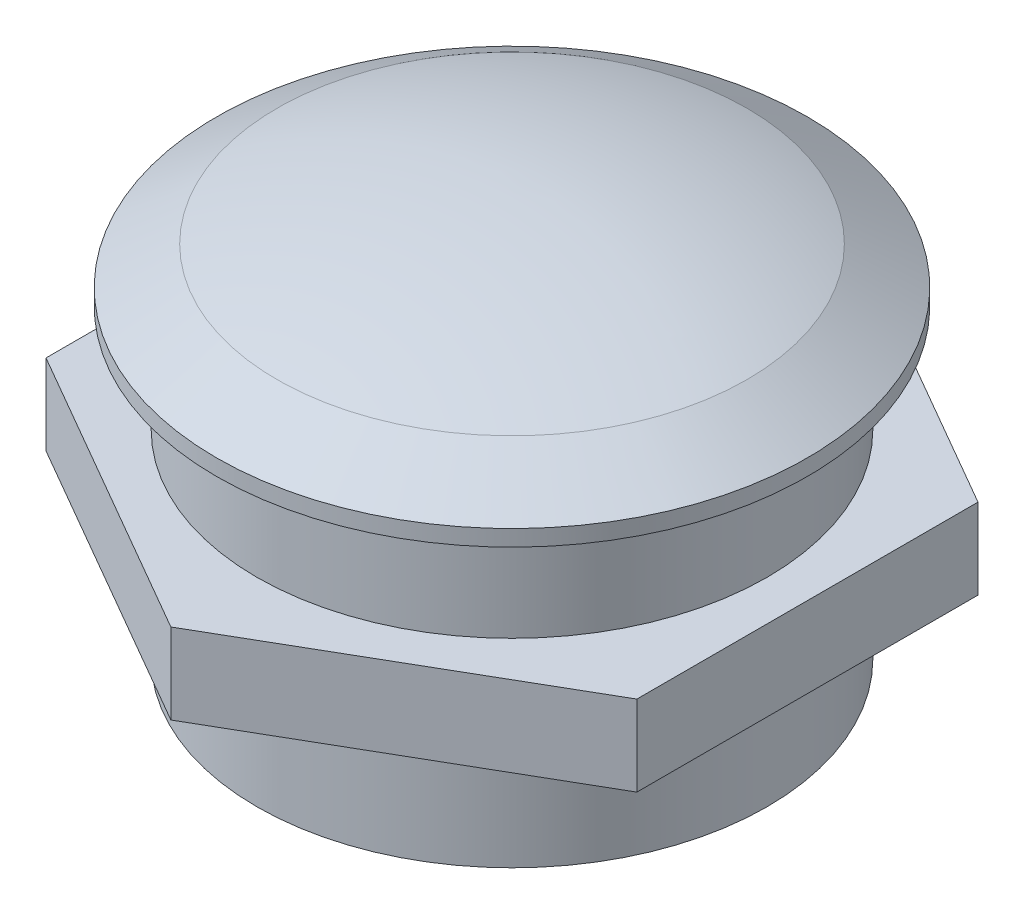
ISO-10303-21;
HEADER;
FILE_DESCRIPTION(('STEP AP214'),'2;1');
FILE_NAME('part.step','',(''),(''),'','','');
FILE_SCHEMA(('AUTOMOTIVE_DESIGN { 1 0 10303 214 1 1 1 1 }'));
ENDSEC;
DATA;
#1=APPLICATION_CONTEXT('core data for automotive mechanical design processes');
#2=APPLICATION_PROTOCOL_DEFINITION('international standard','automotive_design',2000,#1);
#3=PRODUCT_CONTEXT('',#1,'mechanical');
#4=PRODUCT('Part','Part','',(#3));
#5=PRODUCT_RELATED_PRODUCT_CATEGORY('part','',(#4));
#6=PRODUCT_DEFINITION_FORMATION('','',#4);
#7=PRODUCT_DEFINITION_CONTEXT('part definition',#1,'design');
#8=PRODUCT_DEFINITION('design','',#6,#7);
#9=PRODUCT_DEFINITION_SHAPE('','',#8);
#10=(LENGTH_UNIT() NAMED_UNIT(*) SI_UNIT(.MILLI.,.METRE.));
#11=(NAMED_UNIT(*) PLANE_ANGLE_UNIT() SI_UNIT($,.RADIAN.));
#12=(NAMED_UNIT(*) SI_UNIT($,.STERADIAN.) SOLID_ANGLE_UNIT());
#13=UNCERTAINTY_MEASURE_WITH_UNIT(LENGTH_MEASURE(1.E-05),#10,'distance_accuracy_value','');
#14=(GEOMETRIC_REPRESENTATION_CONTEXT(3) GLOBAL_UNCERTAINTY_ASSIGNED_CONTEXT((#13)) GLOBAL_UNIT_ASSIGNED_CONTEXT((#10,
#11,#12)) REPRESENTATION_CONTEXT('',''));
#15=CARTESIAN_POINT('',(0.,0.,0.));
#16=DIRECTION('',(0.,0.,1.));
#17=DIRECTION('',(1.,0.,0.));
#18=AXIS2_PLACEMENT_3D('',#15,#16,#17);
#19=CARTESIAN_POINT('',(0.,3.6,0.));
#20=DIRECTION('',(0.,-1.,0.));
#21=DIRECTION('',(0.,0.,-1.));
#22=AXIS2_PLACEMENT_3D('',#19,#20,#21);
#23=CYLINDRICAL_SURFACE('',#22,9.5);
#24=CARTESIAN_POINT('',(0.,0.,0.));
#25=DIRECTION('',(0.,-1.,0.));
#26=DIRECTION('',(0.,0.,-1.));
#27=AXIS2_PLACEMENT_3D('',#24,#25,#26);
#28=CIRCLE('',#27,9.5);
#29=CARTESIAN_POINT('',(0.,0.,-9.5));
#30=VERTEX_POINT('',#29);
#31=EDGE_CURVE('E139',#30,#30,#28,.T.);
#32=ORIENTED_EDGE('',*,*,#31,.T.);
#33=EDGE_LOOP('',(#32));
#34=FACE_BOUND('',#33,.T.);
#35=CARTESIAN_POINT('',(0.,-4.,0.));
#36=DIRECTION('',(0.,-1.,0.));
#37=DIRECTION('',(0.,0.,-1.));
#38=AXIS2_PLACEMENT_3D('',#35,#36,#37);
#39=CIRCLE('',#38,9.5);
#40=CARTESIAN_POINT('',(0.,-4.,-9.5));
#41=VERTEX_POINT('',#40);
#42=EDGE_CURVE('E138',#41,#41,#39,.F.);
#43=ORIENTED_EDGE('',*,*,#42,.T.);
#44=EDGE_LOOP('',(#43));
#45=FACE_BOUND('',#44,.T.);
#46=ADVANCED_FACE('F33',(#34,#45),#23,.T.);
#47=CARTESIAN_POINT('',(0.,-21.12578125,0.));
#48=DIRECTION('',(0.,-1.,0.));
#49=DIRECTION('',(1.,0.,0.));
#50=AXIS2_PLACEMENT_3D('',#47,#48,#49);
#51=SPHERICAL_SURFACE('',#50,24.72578125);
#52=CARTESIAN_POINT('',(0.,2.,0.));
#53=DIRECTION('',(0.,-1.,0.));
#54=DIRECTION('',(0.,0.,-1.));
#55=AXIS2_PLACEMENT_3D('',#52,#53,#54);
#56=CIRCLE('',#55,8.75);
#57=CARTESIAN_POINT('',(0.,2.,-8.75));
#58=VERTEX_POINT('',#57);
#59=EDGE_CURVE('E148',#58,#58,#56,.T.);
#60=ORIENTED_EDGE('',*,*,#59,.F.);
#61=EDGE_LOOP('',(#60));
#62=FACE_BOUND('',#61,.T.);
#63=ADVANCED_FACE('F178',(#62),#51,.T.);
#64=CARTESIAN_POINT('',(0.,0.6,0.));
#65=DIRECTION('',(0.,-1.,0.));
#66=DIRECTION('',(0.,0.,-1.));
#67=AXIS2_PLACEMENT_3D('',#64,#65,#66);
#68=CONICAL_SURFACE('',#67,11.,1.01419700878467);
#69=ORIENTED_EDGE('',*,*,#59,.T.);
#70=EDGE_LOOP('',(#69));
#71=FACE_BOUND('',#70,.T.);
#72=CARTESIAN_POINT('',(0.,0.6,0.));
#73=DIRECTION('',(0.,-1.,0.));
#74=DIRECTION('',(0.,0.,-1.));
#75=AXIS2_PLACEMENT_3D('',#72,#73,#74);
#76=CIRCLE('',#75,11.);
#77=CARTESIAN_POINT('',(0.,0.6,-11.));
#78=VERTEX_POINT('',#77);
#79=EDGE_CURVE('E145',#78,#78,#76,.T.);
#80=ORIENTED_EDGE('',*,*,#79,.F.);
#81=EDGE_LOOP('',(#80));
#82=FACE_BOUND('',#81,.T.);
#83=ADVANCED_FACE('F183',(#71,#82),#68,.T.);
#84=CARTESIAN_POINT('',(0.,3.6,0.));
#85=DIRECTION('',(0.,-1.,0.));
#86=DIRECTION('',(0.,0.,-1.));
#87=AXIS2_PLACEMENT_3D('',#84,#85,#86);
#88=CYLINDRICAL_SURFACE('',#87,11.);
#89=ORIENTED_EDGE('',*,*,#79,.T.);
#90=EDGE_LOOP('',(#89));
#91=FACE_BOUND('',#90,.T.);
#92=CARTESIAN_POINT('',(0.,0.,0.));
#93=DIRECTION('',(0.,-1.,0.));
#94=DIRECTION('',(0.,0.,-1.));
#95=AXIS2_PLACEMENT_3D('',#92,#93,#94);
#96=CIRCLE('',#95,11.);
#97=CARTESIAN_POINT('',(0.,0.,-11.));
#98=VERTEX_POINT('',#97);
#99=EDGE_CURVE('E142',#98,#98,#96,.T.);
#100=ORIENTED_EDGE('',*,*,#99,.F.);
#101=EDGE_LOOP('',(#100));
#102=FACE_BOUND('',#101,.T.);
#103=ADVANCED_FACE('F200',(#91,#102),#88,.T.);
#104=CARTESIAN_POINT('',(9.5,0.,0.));
#105=DIRECTION('',(0.,-1.,0.));
#106=DIRECTION('',(0.,0.,-1.));
#107=AXIS2_PLACEMENT_3D('',#104,#105,#106);
#108=PLANE('',#107);
#109=ORIENTED_EDGE('',*,*,#99,.T.);
#110=EDGE_LOOP('',(#109));
#111=FACE_BOUND('',#110,.T.);
#112=ORIENTED_EDGE('',*,*,#31,.F.);
#113=EDGE_LOOP('',(#112));
#114=FACE_BOUND('',#113,.T.);
#115=ADVANCED_FACE('F204',(#111,#114),#108,.T.);
#116=CARTESIAN_POINT('',(11.,-7.,6.35085296108589));
#117=DIRECTION('',(-0.5,0.,-0.866025403784438));
#118=DIRECTION('',(-0.866025403784439,0.,0.5));
#119=AXIS2_PLACEMENT_3D('',#116,#117,#118);
#120=PLANE('',#119);
#121=DIRECTION('',(-0.866025403784439,0.,0.5));
#122=VECTOR('',#121,1.);
#123=CARTESIAN_POINT('',(11.,-4.,6.35085296108589));
#124=LINE('',#123,#122);
#125=CARTESIAN_POINT('',(11.,-4.,6.35085296108589));
#126=VERTEX_POINT('',#125);
#127=CARTESIAN_POINT('',(0.,-4.,12.7017059221718));
#128=VERTEX_POINT('',#127);
#129=EDGE_CURVE('E119',#126,#128,#124,.T.);
#130=ORIENTED_EDGE('',*,*,#129,.T.);
#131=DIRECTION('',(0.,1.,0.));
#132=VECTOR('',#131,1.);
#133=CARTESIAN_POINT('',(0.,-7.,12.7017059221718));
#134=LINE('',#133,#132);
#135=CARTESIAN_POINT('',(0.,-7.,12.7017059221718));
#136=VERTEX_POINT('',#135);
#137=EDGE_CURVE('E136',#136,#128,#134,.T.);
#138=ORIENTED_EDGE('',*,*,#137,.F.);
#139=DIRECTION('',(-0.866025403784439,0.,0.5));
#140=VECTOR('',#139,1.);
#141=CARTESIAN_POINT('',(11.,-7.,6.35085296108589));
#142=LINE('',#141,#140);
#143=CARTESIAN_POINT('',(11.,-7.,6.35085296108589));
#144=VERTEX_POINT('',#143);
#145=EDGE_CURVE('E129',#144,#136,#142,.T.);
#146=ORIENTED_EDGE('',*,*,#145,.F.);
#147=DIRECTION('',(0.,1.,0.));
#148=VECTOR('',#147,1.);
#149=CARTESIAN_POINT('',(11.,-7.,6.35085296108589));
#150=LINE('',#149,#148);
#151=EDGE_CURVE('E115',#144,#126,#150,.T.);
#152=ORIENTED_EDGE('',*,*,#151,.T.);
#153=EDGE_LOOP('',(#130,#138,#146,#152));
#154=FACE_BOUND('',#153,.T.);
#155=ADVANCED_FACE('F165',(#154),#120,.F.);
#156=CARTESIAN_POINT('',(0.,-7.,12.7017059221718));
#157=DIRECTION('',(0.5,0.,-0.866025403784439));
#158=DIRECTION('',(-0.866025403784439,0.,-0.5));
#159=AXIS2_PLACEMENT_3D('',#156,#157,#158);
#160=PLANE('',#159);
#161=DIRECTION('',(-0.866025403784439,0.,-0.5));
#162=VECTOR('',#161,1.);
#163=CARTESIAN_POINT('',(0.,-4.,12.7017059221718));
#164=LINE('',#163,#162);
#165=CARTESIAN_POINT('',(-11.,-4.,6.35085296108589));
#166=VERTEX_POINT('',#165);
#167=EDGE_CURVE('E122',#128,#166,#164,.T.);
#168=ORIENTED_EDGE('',*,*,#167,.T.);
#169=DIRECTION('',(0.,1.,0.));
#170=VECTOR('',#169,1.);
#171=CARTESIAN_POINT('',(-11.,-7.,6.35085296108589));
#172=LINE('',#171,#170);
#173=CARTESIAN_POINT('',(-11.,-7.,6.35085296108589));
#174=VERTEX_POINT('',#173);
#175=EDGE_CURVE('E133',#174,#166,#172,.T.);
#176=ORIENTED_EDGE('',*,*,#175,.F.);
#177=DIRECTION('',(-0.866025403784439,0.,-0.5));
#178=VECTOR('',#177,1.);
#179=CARTESIAN_POINT('',(0.,-7.,12.7017059221718));
#180=LINE('',#179,#178);
#181=EDGE_CURVE('E88',#136,#174,#180,.T.);
#182=ORIENTED_EDGE('',*,*,#181,.F.);
#183=ORIENTED_EDGE('',*,*,#137,.T.);
#184=EDGE_LOOP('',(#168,#176,#182,#183));
#185=FACE_BOUND('',#184,.T.);
#186=ADVANCED_FACE('F211',(#185),#160,.F.);
#187=CARTESIAN_POINT('',(-11.,-7.,6.35085296108589));
#188=DIRECTION('',(1.,0.,0.));
#189=DIRECTION('',(0.,0.,-1.));
#190=AXIS2_PLACEMENT_3D('',#187,#188,#189);
#191=PLANE('',#190);
#192=DIRECTION('',(0.,0.,-1.));
#193=VECTOR('',#192,1.);
#194=CARTESIAN_POINT('',(-11.,-4.,6.35085296108589));
#195=LINE('',#194,#193);
#196=CARTESIAN_POINT('',(-11.,-4.,-6.35085296108588));
#197=VERTEX_POINT('',#196);
#198=EDGE_CURVE('E124',#166,#197,#195,.T.);
#199=ORIENTED_EDGE('',*,*,#198,.T.);
#200=DIRECTION('',(0.,1.,0.));
#201=VECTOR('',#200,1.);
#202=CARTESIAN_POINT('',(-11.,-7.,-6.35085296108588));
#203=LINE('',#202,#201);
#204=CARTESIAN_POINT('',(-11.,-7.,-6.35085296108588));
#205=VERTEX_POINT('',#204);
#206=EDGE_CURVE('E110',#205,#197,#203,.T.);
#207=ORIENTED_EDGE('',*,*,#206,.F.);
#208=DIRECTION('',(0.,0.,-1.));
#209=VECTOR('',#208,1.);
#210=CARTESIAN_POINT('',(-11.,-7.,6.35085296108589));
#211=LINE('',#210,#209);
#212=EDGE_CURVE('E101',#174,#205,#211,.T.);
#213=ORIENTED_EDGE('',*,*,#212,.F.);
#214=ORIENTED_EDGE('',*,*,#175,.T.);
#215=EDGE_LOOP('',(#199,#207,#213,#214));
#216=FACE_BOUND('',#215,.T.);
#217=ADVANCED_FACE('F214',(#216),#191,.F.);
#218=CARTESIAN_POINT('',(-11.,-7.,-6.35085296108588));
#219=DIRECTION('',(0.5,0.,0.866025403784439));
#220=DIRECTION('',(0.866025403784439,0.,-0.5));
#221=AXIS2_PLACEMENT_3D('',#218,#219,#220);
#222=PLANE('',#221);
#223=DIRECTION('',(0.866025403784438,0.,-0.5));
#224=VECTOR('',#223,1.);
#225=CARTESIAN_POINT('',(-11.,-4.,-6.35085296108588));
#226=LINE('',#225,#224);
#227=CARTESIAN_POINT('',(0.,-4.,-12.7017059221718));
#228=VERTEX_POINT('',#227);
#229=EDGE_CURVE('E109',#197,#228,#226,.T.);
#230=ORIENTED_EDGE('',*,*,#229,.T.);
#231=DIRECTION('',(0.,1.,0.));
#232=VECTOR('',#231,1.);
#233=CARTESIAN_POINT('',(0.,-7.,-12.7017059221718));
#234=LINE('',#233,#232);
#235=CARTESIAN_POINT('',(0.,-7.,-12.7017059221718));
#236=VERTEX_POINT('',#235);
#237=EDGE_CURVE('E106',#236,#228,#234,.T.);
#238=ORIENTED_EDGE('',*,*,#237,.F.);
#239=DIRECTION('',(0.866025403784438,0.,-0.5));
#240=VECTOR('',#239,1.);
#241=CARTESIAN_POINT('',(-11.,-7.,-6.35085296108588));
#242=LINE('',#241,#240);
#243=EDGE_CURVE('E95',#205,#236,#242,.T.);
#244=ORIENTED_EDGE('',*,*,#243,.F.);
#245=ORIENTED_EDGE('',*,*,#206,.T.);
#246=EDGE_LOOP('',(#230,#238,#244,#245));
#247=FACE_BOUND('',#246,.T.);
#248=ADVANCED_FACE('F107',(#247),#222,.F.);
#249=CARTESIAN_POINT('',(0.,-7.,-12.7017059221718));
#250=DIRECTION('',(-0.5,0.,0.866025403784439));
#251=DIRECTION('',(0.866025403784439,0.,0.5));
#252=AXIS2_PLACEMENT_3D('',#249,#250,#251);
#253=PLANE('',#252);
#254=DIRECTION('',(0.866025403784439,0.,0.5));
#255=VECTOR('',#254,1.);
#256=CARTESIAN_POINT('',(0.,-4.,-12.7017059221718));
#257=LINE('',#256,#255);
#258=CARTESIAN_POINT('',(11.,-4.,-6.35085296108589));
#259=VERTEX_POINT('',#258);
#260=EDGE_CURVE('E73',#228,#259,#257,.T.);
#261=ORIENTED_EDGE('',*,*,#260,.T.);
#262=DIRECTION('',(0.,1.,0.));
#263=VECTOR('',#262,1.);
#264=CARTESIAN_POINT('',(11.,-7.,-6.35085296108589));
#265=LINE('',#264,#263);
#266=CARTESIAN_POINT('',(11.,-7.,-6.35085296108589));
#267=VERTEX_POINT('',#266);
#268=EDGE_CURVE('E111',#267,#259,#265,.T.);
#269=ORIENTED_EDGE('',*,*,#268,.F.);
#270=DIRECTION('',(0.866025403784439,0.,0.5));
#271=VECTOR('',#270,1.);
#272=CARTESIAN_POINT('',(0.,-7.,-12.7017059221718));
#273=LINE('',#272,#271);
#274=EDGE_CURVE('E99',#236,#267,#273,.T.);
#275=ORIENTED_EDGE('',*,*,#274,.F.);
#276=ORIENTED_EDGE('',*,*,#237,.T.);
#277=EDGE_LOOP('',(#261,#269,#275,#276));
#278=FACE_BOUND('',#277,.T.);
#279=ADVANCED_FACE('F113',(#278),#253,.F.);
#280=CARTESIAN_POINT('',(11.,-7.,-6.35085296108589));
#281=DIRECTION('',(-1.,0.,0.));
#282=DIRECTION('',(0.,0.,1.));
#283=AXIS2_PLACEMENT_3D('',#280,#281,#282);
#284=PLANE('',#283);
#285=DIRECTION('',(0.,0.,1.));
#286=VECTOR('',#285,1.);
#287=CARTESIAN_POINT('',(11.,-4.,-6.35085296108589));
#288=LINE('',#287,#286);
#289=EDGE_CURVE('E79',#259,#126,#288,.T.);
#290=ORIENTED_EDGE('',*,*,#289,.T.);
#291=ORIENTED_EDGE('',*,*,#151,.F.);
#292=DIRECTION('',(0.,0.,1.));
#293=VECTOR('',#292,1.);
#294=CARTESIAN_POINT('',(11.,-7.,-6.35085296108589));
#295=LINE('',#294,#293);
#296=EDGE_CURVE('E50',#267,#144,#295,.T.);
#297=ORIENTED_EDGE('',*,*,#296,.F.);
#298=ORIENTED_EDGE('',*,*,#268,.T.);
#299=EDGE_LOOP('',(#290,#291,#297,#298));
#300=FACE_BOUND('',#299,.T.);
#301=ADVANCED_FACE('F167',(#300),#284,.F.);
#302=CARTESIAN_POINT('',(0.,-7.,0.));
#303=DIRECTION('',(0.,-1.,0.));
#304=DIRECTION('',(0.,0.,-1.));
#305=AXIS2_PLACEMENT_3D('',#302,#303,#304);
#306=PLANE('',#305);
#307=CARTESIAN_POINT('',(0.,-7.,0.));
#308=DIRECTION('',(0.,-1.,0.));
#309=DIRECTION('',(0.,0.,-1.));
#310=AXIS2_PLACEMENT_3D('',#307,#308,#309);
#311=CIRCLE('',#310,9.5);
#312=CARTESIAN_POINT('',(0.,-7.,-9.5));
#313=VERTEX_POINT('',#312);
#314=EDGE_CURVE('E11',#313,#313,#311,.F.);
#315=ORIENTED_EDGE('',*,*,#314,.T.);
#316=EDGE_LOOP('',(#315));
#317=FACE_BOUND('',#316,.T.);
#318=ORIENTED_EDGE('',*,*,#145,.T.);
#319=ORIENTED_EDGE('',*,*,#181,.T.);
#320=ORIENTED_EDGE('',*,*,#212,.T.);
#321=ORIENTED_EDGE('',*,*,#243,.T.);
#322=ORIENTED_EDGE('',*,*,#274,.T.);
#323=ORIENTED_EDGE('',*,*,#296,.T.);
#324=EDGE_LOOP('',(#318,#319,#320,#321,#322,#323));
#325=FACE_BOUND('',#324,.T.);
#326=ADVANCED_FACE('F97',(#317,#325),#306,.T.);
#327=CARTESIAN_POINT('',(0.,-4.,0.));
#328=DIRECTION('',(0.,-1.,0.));
#329=DIRECTION('',(0.,0.,-1.));
#330=AXIS2_PLACEMENT_3D('',#327,#328,#329);
#331=PLANE('',#330);
#332=ORIENTED_EDGE('',*,*,#42,.F.);
#333=EDGE_LOOP('',(#332));
#334=FACE_BOUND('',#333,.T.);
#335=ORIENTED_EDGE('',*,*,#129,.F.);
#336=ORIENTED_EDGE('',*,*,#289,.F.);
#337=ORIENTED_EDGE('',*,*,#260,.F.);
#338=ORIENTED_EDGE('',*,*,#229,.F.);
#339=ORIENTED_EDGE('',*,*,#198,.F.);
#340=ORIENTED_EDGE('',*,*,#167,.F.);
#341=EDGE_LOOP('',(#335,#336,#337,#338,#339,#340));
#342=FACE_BOUND('',#341,.T.);
#343=ADVANCED_FACE('F156',(#334,#342),#331,.F.);
#344=CARTESIAN_POINT('',(0.,-11.4,0.));
#345=DIRECTION('',(0.,-1.,0.));
#346=DIRECTION('',(0.,0.,-1.));
#347=AXIS2_PLACEMENT_3D('',#344,#345,#346);
#348=PLANE('',#347);
#349=CARTESIAN_POINT('',(0.,-11.4,0.));
#350=DIRECTION('',(0.,-1.,0.));
#351=DIRECTION('',(0.,0.,-1.));
#352=AXIS2_PLACEMENT_3D('',#349,#350,#351);
#353=CIRCLE('',#352,9.5);
#354=CARTESIAN_POINT('',(0.,-11.4,-9.5));
#355=VERTEX_POINT('',#354);
#356=EDGE_CURVE('E42',#355,#355,#353,.T.);
#357=ORIENTED_EDGE('',*,*,#356,.T.);
#358=EDGE_LOOP('',(#357));
#359=FACE_BOUND('',#358,.T.);
#360=ADVANCED_FACE('F159',(#359),#348,.T.);
#361=ORIENTED_EDGE('',*,*,#314,.F.);
#362=EDGE_LOOP('',(#361));
#363=FACE_BOUND('',#362,.T.);
#364=ORIENTED_EDGE('',*,*,#356,.F.);
#365=EDGE_LOOP('',(#364));
#366=FACE_BOUND('',#365,.T.);
#367=ADVANCED_FACE('F35',(#363,#366),#23,.T.);
#368=CLOSED_SHELL('',(#46,#63,#83,#103,#115,#155,#186,#217,#248,#279,#301,#326,#343,#360,#367));
#369=MANIFOLD_SOLID_BREP('B2',#368);
#370=ADVANCED_BREP_SHAPE_REPRESENTATION('',(#18,#369),#14);
#371=SHAPE_DEFINITION_REPRESENTATION(#9,#370);
ENDSEC;
END-ISO-10303-21;
